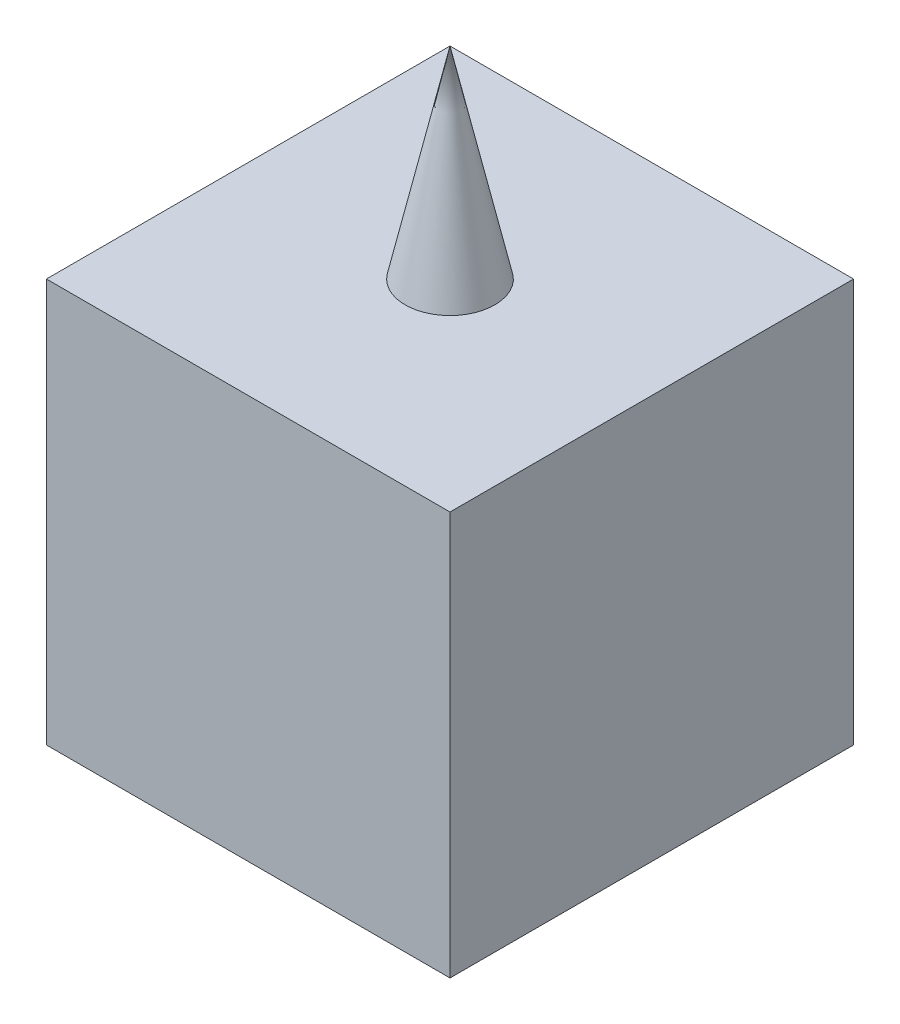
ISO-10303-21;
HEADER;
FILE_DESCRIPTION(('STEP AP214'),'2;1');
FILE_NAME('part.step','',(''),(''),'','','');
FILE_SCHEMA(('AUTOMOTIVE_DESIGN { 1 0 10303 214 1 1 1 1 }'));
ENDSEC;
DATA;
#1=APPLICATION_CONTEXT('core data for automotive mechanical design processes');
#2=APPLICATION_PROTOCOL_DEFINITION('international standard','automotive_design',2000,#1);
#3=PRODUCT_CONTEXT('',#1,'mechanical');
#4=PRODUCT('Part','Part','',(#3));
#5=PRODUCT_RELATED_PRODUCT_CATEGORY('part','',(#4));
#6=PRODUCT_DEFINITION_FORMATION('','',#4);
#7=PRODUCT_DEFINITION_CONTEXT('part definition',#1,'design');
#8=PRODUCT_DEFINITION('design','',#6,#7);
#9=PRODUCT_DEFINITION_SHAPE('','',#8);
#10=(LENGTH_UNIT() NAMED_UNIT(*) SI_UNIT(.MILLI.,.METRE.));
#11=(NAMED_UNIT(*) PLANE_ANGLE_UNIT() SI_UNIT($,.RADIAN.));
#12=(NAMED_UNIT(*) SI_UNIT($,.STERADIAN.) SOLID_ANGLE_UNIT());
#13=UNCERTAINTY_MEASURE_WITH_UNIT(LENGTH_MEASURE(1.E-05),#10,'distance_accuracy_value','');
#14=(GEOMETRIC_REPRESENTATION_CONTEXT(3) GLOBAL_UNCERTAINTY_ASSIGNED_CONTEXT((#13)) GLOBAL_UNIT_ASSIGNED_CONTEXT((#10,
#11,#12)) REPRESENTATION_CONTEXT('',''));
#15=CARTESIAN_POINT('',(0.,0.,0.));
#16=DIRECTION('',(0.,0.,1.));
#17=DIRECTION('',(1.,0.,0.));
#18=AXIS2_PLACEMENT_3D('',#15,#16,#17);
#19=CARTESIAN_POINT('',(76.2,0.,76.2));
#20=DIRECTION('',(0.,-1.,0.));
#21=DIRECTION('',(0.,0.,-1.));
#22=AXIS2_PLACEMENT_3D('',#19,#20,#21);
#23=PLANE('',#22);
#24=CARTESIAN_POINT('',(76.2,0.,76.2));
#25=DIRECTION('',(0.,-1.,0.));
#26=DIRECTION('',(0.,0.,-1.));
#27=AXIS2_PLACEMENT_3D('',#24,#25,#26);
#28=CIRCLE('',#27,50.8);
#29=CARTESIAN_POINT('',(76.2,0.,25.4));
#30=VERTEX_POINT('',#29);
#31=EDGE_CURVE('E13',#30,#30,#28,.T.);
#32=ORIENTED_EDGE('',*,*,#31,.T.);
#33=EDGE_LOOP('',(#32));
#34=FACE_BOUND('',#33,.T.);
#35=ADVANCED_FACE('F46',(#34),#23,.T.);
#36=CARTESIAN_POINT('',(76.2,228.6,76.2));
#37=DIRECTION('',(0.,-1.,0.));
#38=DIRECTION('',(0.,0.,-1.));
#39=AXIS2_PLACEMENT_3D('',#36,#37,#38);
#40=CONICAL_SURFACE('',#39,0.,0.218668945873942);
#41=ORIENTED_EDGE('',*,*,#31,.F.);
#42=EDGE_LOOP('',(#41));
#43=FACE_BOUND('',#42,.T.);
#44=CARTESIAN_POINT('',(76.2,228.6,76.2));
#45=VERTEX_POINT('',#44);
#46=VERTEX_LOOP('',#45);
#47=FACE_BOUND('',#46,.T.);
#48=ADVANCED_FACE('F48',(#43,#47),#40,.T.);
#49=CLOSED_SHELL('',(#35,#48));
#50=MANIFOLD_SOLID_BREP('B2',#49);
#51=CARTESIAN_POINT('',(0.,0.,152.4));
#52=DIRECTION('',(1.,0.,0.));
#53=DIRECTION('',(0.,0.,-1.));
#54=AXIS2_PLACEMENT_3D('',#51,#52,#53);
#55=PLANE('',#54);
#56=DIRECTION('',(0.,-1.,0.));
#57=VECTOR('',#56,1.);
#58=CARTESIAN_POINT('',(0.,0.,0.));
#59=LINE('',#58,#57);
#60=CARTESIAN_POINT('',(0.,152.4,0.));
#61=VERTEX_POINT('',#60);
#62=CARTESIAN_POINT('',(0.,0.,0.));
#63=VERTEX_POINT('',#62);
#64=EDGE_CURVE('E159',#61,#63,#59,.T.);
#65=ORIENTED_EDGE('',*,*,#64,.T.);
#66=DIRECTION('',(0.,0.,-1.));
#67=VECTOR('',#66,1.);
#68=CARTESIAN_POINT('',(0.,0.,152.4));
#69=LINE('',#68,#67);
#70=CARTESIAN_POINT('',(0.,0.,152.4));
#71=VERTEX_POINT('',#70);
#72=EDGE_CURVE('E44',#71,#63,#69,.T.);
#73=ORIENTED_EDGE('',*,*,#72,.F.);
#74=DIRECTION('',(0.,-1.,0.));
#75=VECTOR('',#74,1.);
#76=CARTESIAN_POINT('',(0.,0.,152.4));
#77=LINE('',#76,#75);
#78=CARTESIAN_POINT('',(0.,152.4,152.4));
#79=VERTEX_POINT('',#78);
#80=EDGE_CURVE('E147',#79,#71,#77,.T.);
#81=ORIENTED_EDGE('',*,*,#80,.F.);
#82=DIRECTION('',(0.,0.,-1.));
#83=VECTOR('',#82,1.);
#84=CARTESIAN_POINT('',(0.,152.4,152.4));
#85=LINE('',#84,#83);
#86=EDGE_CURVE('E155',#79,#61,#85,.T.);
#87=ORIENTED_EDGE('',*,*,#86,.T.);
#88=EDGE_LOOP('',(#65,#73,#81,#87));
#89=FACE_BOUND('',#88,.T.);
#90=ADVANCED_FACE('F96',(#89),#55,.F.);
#91=CARTESIAN_POINT('',(0.,0.,152.4));
#92=DIRECTION('',(0.,1.,0.));
#93=DIRECTION('',(0.,0.,1.));
#94=AXIS2_PLACEMENT_3D('',#91,#92,#93);
#95=PLANE('',#94);
#96=DIRECTION('',(1.,0.,0.));
#97=VECTOR('',#96,1.);
#98=CARTESIAN_POINT('',(0.,0.,0.));
#99=LINE('',#98,#97);
#100=CARTESIAN_POINT('',(152.4,0.,0.));
#101=VERTEX_POINT('',#100);
#102=EDGE_CURVE('E151',#63,#101,#99,.T.);
#103=ORIENTED_EDGE('',*,*,#102,.T.);
#104=DIRECTION('',(0.,0.,-1.));
#105=VECTOR('',#104,1.);
#106=CARTESIAN_POINT('',(152.4,0.,152.4));
#107=LINE('',#106,#105);
#108=CARTESIAN_POINT('',(152.4,0.,152.4));
#109=VERTEX_POINT('',#108);
#110=EDGE_CURVE('E104',#109,#101,#107,.T.);
#111=ORIENTED_EDGE('',*,*,#110,.F.);
#112=DIRECTION('',(1.,0.,0.));
#113=VECTOR('',#112,1.);
#114=CARTESIAN_POINT('',(0.,0.,152.4));
#115=LINE('',#114,#113);
#116=EDGE_CURVE('E142',#71,#109,#115,.T.);
#117=ORIENTED_EDGE('',*,*,#116,.F.);
#118=ORIENTED_EDGE('',*,*,#72,.T.);
#119=EDGE_LOOP('',(#103,#111,#117,#118));
#120=FACE_BOUND('',#119,.T.);
#121=ADVANCED_FACE('F150',(#120),#95,.F.);
#122=CARTESIAN_POINT('',(152.4,0.,152.4));
#123=DIRECTION('',(-1.,0.,0.));
#124=DIRECTION('',(0.,0.,1.));
#125=AXIS2_PLACEMENT_3D('',#122,#123,#124);
#126=PLANE('',#125);
#127=DIRECTION('',(0.,1.,0.));
#128=VECTOR('',#127,1.);
#129=CARTESIAN_POINT('',(152.4,0.,0.));
#130=LINE('',#129,#128);
#131=CARTESIAN_POINT('',(152.4,152.4,0.));
#132=VERTEX_POINT('',#131);
#133=EDGE_CURVE('E129',#101,#132,#130,.T.);
#134=ORIENTED_EDGE('',*,*,#133,.T.);
#135=DIRECTION('',(0.,0.,-1.));
#136=VECTOR('',#135,1.);
#137=CARTESIAN_POINT('',(152.4,152.4,152.4));
#138=LINE('',#137,#136);
#139=CARTESIAN_POINT('',(152.4,152.4,152.4));
#140=VERTEX_POINT('',#139);
#141=EDGE_CURVE('E152',#140,#132,#138,.T.);
#142=ORIENTED_EDGE('',*,*,#141,.F.);
#143=DIRECTION('',(0.,1.,0.));
#144=VECTOR('',#143,1.);
#145=CARTESIAN_POINT('',(152.4,0.,152.4));
#146=LINE('',#145,#144);
#147=EDGE_CURVE('E145',#109,#140,#146,.T.);
#148=ORIENTED_EDGE('',*,*,#147,.F.);
#149=ORIENTED_EDGE('',*,*,#110,.T.);
#150=EDGE_LOOP('',(#134,#142,#148,#149));
#151=FACE_BOUND('',#150,.T.);
#152=ADVANCED_FACE('F153',(#151),#126,.F.);
#153=CARTESIAN_POINT('',(0.,152.4,152.4));
#154=DIRECTION('',(0.,-1.,0.));
#155=DIRECTION('',(0.,0.,-1.));
#156=AXIS2_PLACEMENT_3D('',#153,#154,#155);
#157=PLANE('',#156);
#158=DIRECTION('',(-1.,0.,0.));
#159=VECTOR('',#158,1.);
#160=CARTESIAN_POINT('',(0.,152.4,0.));
#161=LINE('',#160,#159);
#162=EDGE_CURVE('E135',#132,#61,#161,.T.);
#163=ORIENTED_EDGE('',*,*,#162,.T.);
#164=ORIENTED_EDGE('',*,*,#86,.F.);
#165=DIRECTION('',(-1.,0.,0.));
#166=VECTOR('',#165,1.);
#167=CARTESIAN_POINT('',(0.,152.4,152.4));
#168=LINE('',#167,#166);
#169=EDGE_CURVE('E112',#140,#79,#168,.T.);
#170=ORIENTED_EDGE('',*,*,#169,.F.);
#171=ORIENTED_EDGE('',*,*,#141,.T.);
#172=EDGE_LOOP('',(#163,#164,#170,#171));
#173=FACE_BOUND('',#172,.T.);
#174=ADVANCED_FACE('F166',(#173),#157,.F.);
#175=CARTESIAN_POINT('',(0.,152.4,152.4));
#176=DIRECTION('',(0.,0.,-1.));
#177=DIRECTION('',(-1.,0.,0.));
#178=AXIS2_PLACEMENT_3D('',#175,#176,#177);
#179=PLANE('',#178);
#180=ORIENTED_EDGE('',*,*,#80,.T.);
#181=ORIENTED_EDGE('',*,*,#116,.T.);
#182=ORIENTED_EDGE('',*,*,#147,.T.);
#183=ORIENTED_EDGE('',*,*,#169,.T.);
#184=EDGE_LOOP('',(#180,#181,#182,#183));
#185=FACE_BOUND('',#184,.T.);
#186=ADVANCED_FACE('F143',(#185),#179,.F.);
#187=CARTESIAN_POINT('',(0.,152.4,0.));
#188=DIRECTION('',(0.,0.,-1.));
#189=DIRECTION('',(-1.,0.,0.));
#190=AXIS2_PLACEMENT_3D('',#187,#188,#189);
#191=PLANE('',#190);
#192=ORIENTED_EDGE('',*,*,#64,.F.);
#193=ORIENTED_EDGE('',*,*,#162,.F.);
#194=ORIENTED_EDGE('',*,*,#133,.F.);
#195=ORIENTED_EDGE('',*,*,#102,.F.);
#196=EDGE_LOOP('',(#192,#193,#194,#195));
#197=FACE_BOUND('',#196,.T.);
#198=ADVANCED_FACE('F169',(#197),#191,.T.);
#199=CLOSED_SHELL('',(#90,#121,#152,#174,#186,#198));
#200=MANIFOLD_SOLID_BREP('B7',#199);
#201=ADVANCED_BREP_SHAPE_REPRESENTATION('',(#18,#50,#200),#14);
#202=SHAPE_DEFINITION_REPRESENTATION(#9,#201);
ENDSEC;
END-ISO-10303-21;
